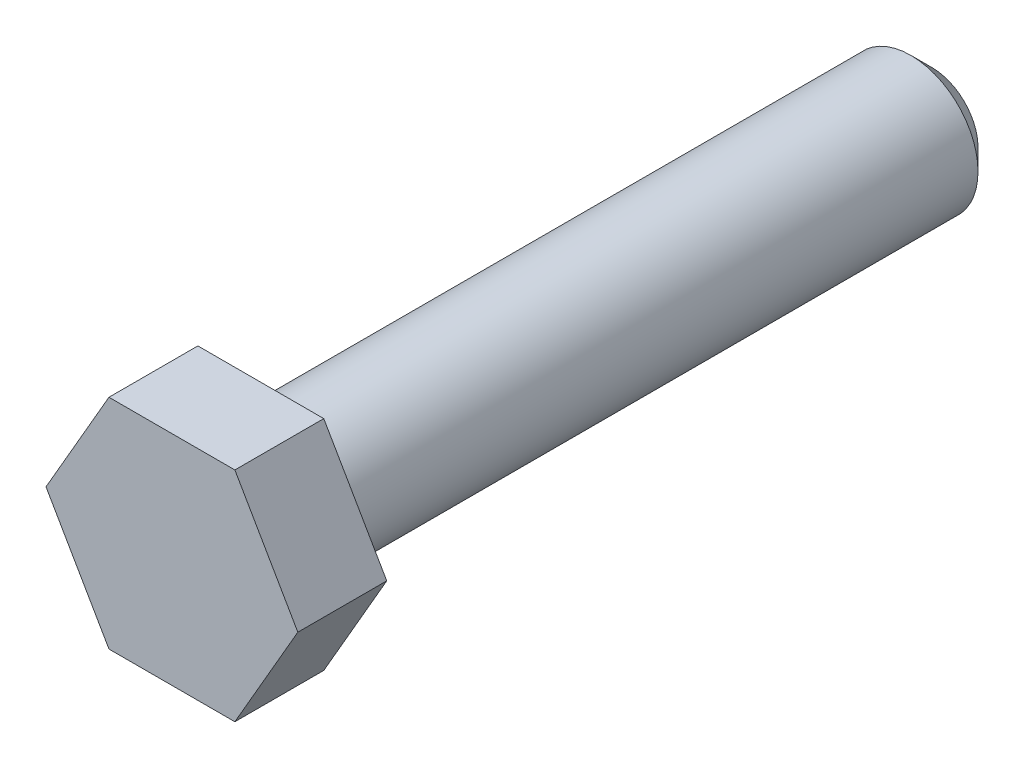
ISO-10303-21;
HEADER;
FILE_DESCRIPTION(('STEP AP214'),'2;1');
FILE_NAME('part.step','',(''),(''),'','','');
FILE_SCHEMA(('AUTOMOTIVE_DESIGN { 1 0 10303 214 1 1 1 1 }'));
ENDSEC;
DATA;
#1=APPLICATION_CONTEXT('core data for automotive mechanical design processes');
#2=APPLICATION_PROTOCOL_DEFINITION('international standard','automotive_design',2000,#1);
#3=PRODUCT_CONTEXT('',#1,'mechanical');
#4=PRODUCT('Part','Part','',(#3));
#5=PRODUCT_RELATED_PRODUCT_CATEGORY('part','',(#4));
#6=PRODUCT_DEFINITION_FORMATION('','',#4);
#7=PRODUCT_DEFINITION_CONTEXT('part definition',#1,'design');
#8=PRODUCT_DEFINITION('design','',#6,#7);
#9=PRODUCT_DEFINITION_SHAPE('','',#8);
#10=(LENGTH_UNIT() NAMED_UNIT(*) SI_UNIT(.MILLI.,.METRE.));
#11=(NAMED_UNIT(*) PLANE_ANGLE_UNIT() SI_UNIT($,.RADIAN.));
#12=(NAMED_UNIT(*) SI_UNIT($,.STERADIAN.) SOLID_ANGLE_UNIT());
#13=UNCERTAINTY_MEASURE_WITH_UNIT(LENGTH_MEASURE(1.E-05),#10,'distance_accuracy_value','');
#14=(GEOMETRIC_REPRESENTATION_CONTEXT(3) GLOBAL_UNCERTAINTY_ASSIGNED_CONTEXT((#13)) GLOBAL_UNIT_ASSIGNED_CONTEXT((#10,
#11,#12)) REPRESENTATION_CONTEXT('',''));
#15=CARTESIAN_POINT('',(0.,0.,0.));
#16=DIRECTION('',(0.,0.,1.));
#17=DIRECTION('',(1.,0.,0.));
#18=AXIS2_PLACEMENT_3D('',#15,#16,#17);
#19=CARTESIAN_POINT('',(-11.2583302491977,-6.5,0.));
#20=DIRECTION('',(0.,0.,1.));
#21=DIRECTION('',(1.,0.,0.));
#22=AXIS2_PLACEMENT_3D('',#19,#20,#21);
#23=PLANE('',#22);
#24=DIRECTION('',(-0.499999999999999,-0.866025403784439,0.));
#25=VECTOR('',#24,1.);
#26=CARTESIAN_POINT('',(-3.75277674973257,6.5,0.));
#27=LINE('',#26,#25);
#28=CARTESIAN_POINT('',(-3.75277674973257,6.5,0.));
#29=VERTEX_POINT('',#28);
#30=CARTESIAN_POINT('',(-7.50555349946513,0.,0.));
#31=VERTEX_POINT('',#30);
#32=EDGE_CURVE('E117',#29,#31,#27,.T.);
#33=ORIENTED_EDGE('',*,*,#32,.F.);
#34=DIRECTION('',(1.,0.,0.));
#35=VECTOR('',#34,1.);
#36=CARTESIAN_POINT('',(-3.75277674973257,6.5,0.));
#37=LINE('',#36,#35);
#38=CARTESIAN_POINT('',(3.75277674973256,6.5,0.));
#39=VERTEX_POINT('',#38);
#40=EDGE_CURVE('E127',#29,#39,#37,.T.);
#41=ORIENTED_EDGE('',*,*,#40,.T.);
#42=DIRECTION('',(0.5,-0.866025403784438,0.));
#43=VECTOR('',#42,1.);
#44=CARTESIAN_POINT('',(3.75277674973256,6.5,0.));
#45=LINE('',#44,#43);
#46=CARTESIAN_POINT('',(7.50555349946513,0.,0.));
#47=VERTEX_POINT('',#46);
#48=EDGE_CURVE('E125',#39,#47,#45,.T.);
#49=ORIENTED_EDGE('',*,*,#48,.T.);
#50=DIRECTION('',(-0.5,-0.866025403784439,0.));
#51=VECTOR('',#50,1.);
#52=CARTESIAN_POINT('',(7.50555349946513,0.,0.));
#53=LINE('',#52,#51);
#54=CARTESIAN_POINT('',(3.75277674973257,-6.5,0.));
#55=VERTEX_POINT('',#54);
#56=EDGE_CURVE('E96',#47,#55,#53,.T.);
#57=ORIENTED_EDGE('',*,*,#56,.T.);
#58=DIRECTION('',(1.,0.,0.));
#59=VECTOR('',#58,1.);
#60=CARTESIAN_POINT('',(-3.75277674973257,-6.5,0.));
#61=LINE('',#60,#59);
#62=CARTESIAN_POINT('',(-3.75277674973257,-6.5,0.));
#63=VERTEX_POINT('',#62);
#64=EDGE_CURVE('E121',#63,#55,#61,.T.);
#65=ORIENTED_EDGE('',*,*,#64,.F.);
#66=DIRECTION('',(0.5,-0.866025403784439,0.));
#67=VECTOR('',#66,1.);
#68=CARTESIAN_POINT('',(-7.50555349946513,0.,0.));
#69=LINE('',#68,#67);
#70=EDGE_CURVE('E119',#31,#63,#69,.T.);
#71=ORIENTED_EDGE('',*,*,#70,.F.);
#72=EDGE_LOOP('',(#33,#41,#49,#57,#65,#71));
#73=FACE_BOUND('',#72,.T.);
#74=CARTESIAN_POINT('',(0.,0.,0.));
#75=DIRECTION('',(0.,0.,1.));
#76=DIRECTION('',(1.,0.,0.));
#77=AXIS2_PLACEMENT_3D('',#74,#75,#76);
#78=CIRCLE('',#77,4.);
#79=CARTESIAN_POINT('',(4.,0.,0.));
#80=VERTEX_POINT('',#79);
#81=EDGE_CURVE('E139',#80,#80,#78,.F.);
#82=ORIENTED_EDGE('',*,*,#81,.F.);
#83=EDGE_LOOP('',(#82));
#84=FACE_BOUND('',#83,.T.);
#85=ADVANCED_FACE('F31',(#73,#84),#23,.F.);
#86=CARTESIAN_POINT('',(-3.75277674973257,6.5,5.3));
#87=DIRECTION('',(0.866025403784439,-0.499999999999999,0.));
#88=DIRECTION('',(0.499999999999999,0.866025403784439,0.));
#89=AXIS2_PLACEMENT_3D('',#86,#87,#88);
#90=PLANE('',#89);
#91=ORIENTED_EDGE('',*,*,#32,.T.);
#92=DIRECTION('',(0.,0.,-1.));
#93=VECTOR('',#92,1.);
#94=CARTESIAN_POINT('',(-7.50555349946513,0.,5.3));
#95=LINE('',#94,#93);
#96=CARTESIAN_POINT('',(-7.50555349946513,0.,5.3));
#97=VERTEX_POINT('',#96);
#98=EDGE_CURVE('E137',#97,#31,#95,.T.);
#99=ORIENTED_EDGE('',*,*,#98,.F.);
#100=DIRECTION('',(-0.499999999999999,-0.866025403784439,0.));
#101=VECTOR('',#100,1.);
#102=CARTESIAN_POINT('',(-3.75277674973257,6.5,5.3));
#103=LINE('',#102,#101);
#104=CARTESIAN_POINT('',(-3.75277674973257,6.5,5.3));
#105=VERTEX_POINT('',#104);
#106=EDGE_CURVE('E130',#105,#97,#103,.T.);
#107=ORIENTED_EDGE('',*,*,#106,.F.);
#108=DIRECTION('',(0.,0.,-1.));
#109=VECTOR('',#108,1.);
#110=CARTESIAN_POINT('',(-3.75277674973257,6.5,5.3));
#111=LINE('',#110,#109);
#112=EDGE_CURVE('E48',#105,#29,#111,.T.);
#113=ORIENTED_EDGE('',*,*,#112,.T.);
#114=EDGE_LOOP('',(#91,#99,#107,#113));
#115=FACE_BOUND('',#114,.T.);
#116=ADVANCED_FACE('F155',(#115),#90,.F.);
#117=CARTESIAN_POINT('',(-7.50555349946513,0.,5.3));
#118=DIRECTION('',(0.866025403784439,0.5,0.));
#119=DIRECTION('',(-0.5,0.866025403784439,0.));
#120=AXIS2_PLACEMENT_3D('',#117,#118,#119);
#121=PLANE('',#120);
#122=ORIENTED_EDGE('',*,*,#70,.T.);
#123=DIRECTION('',(0.,0.,-1.));
#124=VECTOR('',#123,1.);
#125=CARTESIAN_POINT('',(-3.75277674973257,-6.5,5.3));
#126=LINE('',#125,#124);
#127=CARTESIAN_POINT('',(-3.75277674973257,-6.5,5.3));
#128=VERTEX_POINT('',#127);
#129=EDGE_CURVE('E134',#128,#63,#126,.T.);
#130=ORIENTED_EDGE('',*,*,#129,.F.);
#131=DIRECTION('',(0.5,-0.866025403784439,0.));
#132=VECTOR('',#131,1.);
#133=CARTESIAN_POINT('',(-7.50555349946513,0.,5.3));
#134=LINE('',#133,#132);
#135=EDGE_CURVE('E81',#97,#128,#134,.T.);
#136=ORIENTED_EDGE('',*,*,#135,.F.);
#137=ORIENTED_EDGE('',*,*,#98,.T.);
#138=EDGE_LOOP('',(#122,#130,#136,#137));
#139=FACE_BOUND('',#138,.T.);
#140=ADVANCED_FACE('F161',(#139),#121,.F.);
#141=CARTESIAN_POINT('',(-3.75277674973257,-6.5,5.3));
#142=DIRECTION('',(0.,1.,0.));
#143=DIRECTION('',(0.,0.,1.));
#144=AXIS2_PLACEMENT_3D('',#141,#142,#143);
#145=PLANE('',#144);
#146=ORIENTED_EDGE('',*,*,#64,.T.);
#147=DIRECTION('',(0.,0.,-1.));
#148=VECTOR('',#147,1.);
#149=CARTESIAN_POINT('',(3.75277674973257,-6.5,5.3));
#150=LINE('',#149,#148);
#151=CARTESIAN_POINT('',(3.75277674973257,-6.5,5.3));
#152=VERTEX_POINT('',#151);
#153=EDGE_CURVE('E100',#152,#55,#150,.T.);
#154=ORIENTED_EDGE('',*,*,#153,.F.);
#155=DIRECTION('',(1.,0.,0.));
#156=VECTOR('',#155,1.);
#157=CARTESIAN_POINT('',(-3.75277674973257,-6.5,5.3));
#158=LINE('',#157,#156);
#159=EDGE_CURVE('E108',#128,#152,#158,.T.);
#160=ORIENTED_EDGE('',*,*,#159,.F.);
#161=ORIENTED_EDGE('',*,*,#129,.T.);
#162=EDGE_LOOP('',(#146,#154,#160,#161));
#163=FACE_BOUND('',#162,.T.);
#164=ADVANCED_FACE('F173',(#163),#145,.F.);
#165=CARTESIAN_POINT('',(7.50555349946513,0.,5.3));
#166=DIRECTION('',(0.866025403784439,-0.5,0.));
#167=DIRECTION('',(0.5,0.866025403784439,0.));
#168=AXIS2_PLACEMENT_3D('',#165,#166,#167);
#169=PLANE('',#168);
#170=ORIENTED_EDGE('',*,*,#56,.F.);
#171=DIRECTION('',(0.,0.,-1.));
#172=VECTOR('',#171,1.);
#173=CARTESIAN_POINT('',(7.50555349946513,0.,5.3));
#174=LINE('',#173,#172);
#175=CARTESIAN_POINT('',(7.50555349946513,0.,5.3));
#176=VERTEX_POINT('',#175);
#177=EDGE_CURVE('E91',#176,#47,#174,.T.);
#178=ORIENTED_EDGE('',*,*,#177,.F.);
#179=DIRECTION('',(-0.5,-0.866025403784439,0.));
#180=VECTOR('',#179,1.);
#181=CARTESIAN_POINT('',(7.50555349946513,0.,5.3));
#182=LINE('',#181,#180);
#183=EDGE_CURVE('E94',#176,#152,#182,.T.);
#184=ORIENTED_EDGE('',*,*,#183,.T.);
#185=ORIENTED_EDGE('',*,*,#153,.T.);
#186=EDGE_LOOP('',(#170,#178,#184,#185));
#187=FACE_BOUND('',#186,.T.);
#188=ADVANCED_FACE('F93',(#187),#169,.T.);
#189=CARTESIAN_POINT('',(3.75277674973256,6.5,5.3));
#190=DIRECTION('',(0.866025403784438,0.5,0.));
#191=DIRECTION('',(-0.5,0.866025403784438,0.));
#192=AXIS2_PLACEMENT_3D('',#189,#190,#191);
#193=PLANE('',#192);
#194=ORIENTED_EDGE('',*,*,#48,.F.);
#195=DIRECTION('',(0.,0.,-1.));
#196=VECTOR('',#195,1.);
#197=CARTESIAN_POINT('',(3.75277674973256,6.5,5.3));
#198=LINE('',#197,#196);
#199=CARTESIAN_POINT('',(3.75277674973256,6.5,5.3));
#200=VERTEX_POINT('',#199);
#201=EDGE_CURVE('E68',#200,#39,#198,.T.);
#202=ORIENTED_EDGE('',*,*,#201,.F.);
#203=DIRECTION('',(0.5,-0.866025403784438,0.));
#204=VECTOR('',#203,1.);
#205=CARTESIAN_POINT('',(3.75277674973256,6.5,5.3));
#206=LINE('',#205,#204);
#207=EDGE_CURVE('E106',#200,#176,#206,.T.);
#208=ORIENTED_EDGE('',*,*,#207,.T.);
#209=ORIENTED_EDGE('',*,*,#177,.T.);
#210=EDGE_LOOP('',(#194,#202,#208,#209));
#211=FACE_BOUND('',#210,.T.);
#212=ADVANCED_FACE('F111',(#211),#193,.T.);
#213=CARTESIAN_POINT('',(-3.75277674973257,6.5,5.3));
#214=DIRECTION('',(0.,1.,0.));
#215=DIRECTION('',(0.,0.,1.));
#216=AXIS2_PLACEMENT_3D('',#213,#214,#215);
#217=PLANE('',#216);
#218=ORIENTED_EDGE('',*,*,#40,.F.);
#219=ORIENTED_EDGE('',*,*,#112,.F.);
#220=DIRECTION('',(1.,0.,0.));
#221=VECTOR('',#220,1.);
#222=CARTESIAN_POINT('',(-3.75277674973257,6.5,5.3));
#223=LINE('',#222,#221);
#224=EDGE_CURVE('E112',#105,#200,#223,.T.);
#225=ORIENTED_EDGE('',*,*,#224,.T.);
#226=ORIENTED_EDGE('',*,*,#201,.T.);
#227=EDGE_LOOP('',(#218,#219,#225,#226));
#228=FACE_BOUND('',#227,.T.);
#229=ADVANCED_FACE('F166',(#228),#217,.T.);
#230=CARTESIAN_POINT('',(-11.2583302491977,-6.5,5.3));
#231=DIRECTION('',(0.,0.,1.));
#232=DIRECTION('',(1.,0.,0.));
#233=AXIS2_PLACEMENT_3D('',#230,#231,#232);
#234=PLANE('',#233);
#235=ORIENTED_EDGE('',*,*,#106,.T.);
#236=ORIENTED_EDGE('',*,*,#135,.T.);
#237=ORIENTED_EDGE('',*,*,#159,.T.);
#238=ORIENTED_EDGE('',*,*,#183,.F.);
#239=ORIENTED_EDGE('',*,*,#207,.F.);
#240=ORIENTED_EDGE('',*,*,#224,.F.);
#241=EDGE_LOOP('',(#235,#236,#237,#238,#239,#240));
#242=FACE_BOUND('',#241,.T.);
#243=ADVANCED_FACE('F104',(#242),#234,.T.);
#244=CARTESIAN_POINT('',(0.,0.,-40.));
#245=DIRECTION('',(0.,0.,1.));
#246=DIRECTION('',(1.,0.,0.));
#247=AXIS2_PLACEMENT_3D('',#244,#245,#246);
#248=CYLINDRICAL_SURFACE('',#247,4.);
#249=CARTESIAN_POINT('',(0.,0.,-38.75));
#250=DIRECTION('',(0.,0.,-1.));
#251=DIRECTION('',(-1.,0.,0.));
#252=AXIS2_PLACEMENT_3D('',#249,#250,#251);
#253=CIRCLE('',#252,4.);
#254=CARTESIAN_POINT('',(-4.,0.,-38.75));
#255=VERTEX_POINT('',#254);
#256=EDGE_CURVE('E11',#255,#255,#253,.F.);
#257=ORIENTED_EDGE('',*,*,#256,.T.);
#258=EDGE_LOOP('',(#257));
#259=FACE_BOUND('',#258,.T.);
#260=ORIENTED_EDGE('',*,*,#81,.T.);
#261=EDGE_LOOP('',(#260));
#262=FACE_BOUND('',#261,.T.);
#263=ADVANCED_FACE('F151',(#259,#262),#248,.T.);
#264=CARTESIAN_POINT('',(0.,0.,-40.));
#265=DIRECTION('',(0.,0.,-1.));
#266=DIRECTION('',(-1.,0.,0.));
#267=AXIS2_PLACEMENT_3D('',#264,#265,#266);
#268=PLANE('',#267);
#269=CARTESIAN_POINT('',(0.,0.,-40.));
#270=DIRECTION('',(0.,0.,-1.));
#271=DIRECTION('',(-1.,0.,0.));
#272=AXIS2_PLACEMENT_3D('',#269,#270,#271);
#273=CIRCLE('',#272,2.74999999999998);
#274=CARTESIAN_POINT('',(-2.74999999999998,0.,-40.));
#275=VERTEX_POINT('',#274);
#276=EDGE_CURVE('E40',#275,#275,#273,.T.);
#277=ORIENTED_EDGE('',*,*,#276,.T.);
#278=EDGE_LOOP('',(#277));
#279=FACE_BOUND('',#278,.T.);
#280=ADVANCED_FACE('F144',(#279),#268,.T.);
#281=CARTESIAN_POINT('',(0.,0.,-40.));
#282=DIRECTION('',(0.,0.,1.));
#283=DIRECTION('',(1.,0.,0.));
#284=AXIS2_PLACEMENT_3D('',#281,#282,#283);
#285=CONICAL_SURFACE('',#284,2.74999999999998,0.785398163397454);
#286=ORIENTED_EDGE('',*,*,#256,.F.);
#287=EDGE_LOOP('',(#286));
#288=FACE_BOUND('',#287,.T.);
#289=ORIENTED_EDGE('',*,*,#276,.F.);
#290=EDGE_LOOP('',(#289));
#291=FACE_BOUND('',#290,.T.);
#292=ADVANCED_FACE('F33',(#288,#291),#285,.T.);
#293=CLOSED_SHELL('',(#85,#116,#140,#164,#188,#212,#229,#243,#263,#280,#292));
#294=MANIFOLD_SOLID_BREP('B2',#293);
#295=ADVANCED_BREP_SHAPE_REPRESENTATION('',(#18,#294),#14);
#296=SHAPE_DEFINITION_REPRESENTATION(#9,#295);
ENDSEC;
END-ISO-10303-21;
